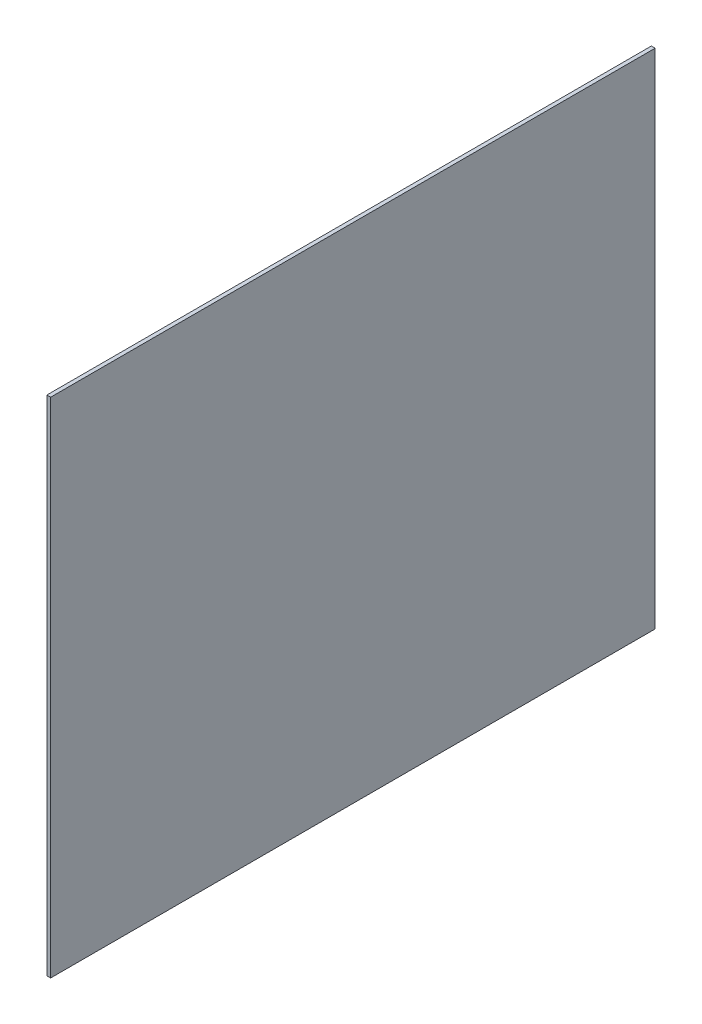
ISO-10303-21;
HEADER;
FILE_DESCRIPTION(('STEP AP214'),'2;1');
FILE_NAME('part.step','',(''),(''),'','','');
FILE_SCHEMA(('AUTOMOTIVE_DESIGN { 1 0 10303 214 1 1 1 1 }'));
ENDSEC;
DATA;
#1=APPLICATION_CONTEXT('core data for automotive mechanical design processes');
#2=APPLICATION_PROTOCOL_DEFINITION('international standard','automotive_design',2000,#1);
#3=PRODUCT_CONTEXT('',#1,'mechanical');
#4=PRODUCT('Part','Part','',(#3));
#5=PRODUCT_RELATED_PRODUCT_CATEGORY('part','',(#4));
#6=PRODUCT_DEFINITION_FORMATION('','',#4);
#7=PRODUCT_DEFINITION_CONTEXT('part definition',#1,'design');
#8=PRODUCT_DEFINITION('design','',#6,#7);
#9=PRODUCT_DEFINITION_SHAPE('','',#8);
#10=(LENGTH_UNIT() NAMED_UNIT(*) SI_UNIT(.MILLI.,.METRE.));
#11=(NAMED_UNIT(*) PLANE_ANGLE_UNIT() SI_UNIT($,.RADIAN.));
#12=(NAMED_UNIT(*) SI_UNIT($,.STERADIAN.) SOLID_ANGLE_UNIT());
#13=UNCERTAINTY_MEASURE_WITH_UNIT(LENGTH_MEASURE(1.E-05),#10,'distance_accuracy_value','');
#14=(GEOMETRIC_REPRESENTATION_CONTEXT(3) GLOBAL_UNCERTAINTY_ASSIGNED_CONTEXT((#13)) GLOBAL_UNIT_ASSIGNED_CONTEXT((#10,
#11,#12)) REPRESENTATION_CONTEXT('',''));
#15=CARTESIAN_POINT('',(0.,0.,0.));
#16=DIRECTION('',(0.,0.,1.));
#17=DIRECTION('',(1.,0.,0.));
#18=AXIS2_PLACEMENT_3D('',#15,#16,#17);
#19=CARTESIAN_POINT('',(-12.5,-1664.15980180936,2000.));
#20=DIRECTION('',(1.,0.,0.));
#21=DIRECTION('',(0.,0.,-1.));
#22=AXIS2_PLACEMENT_3D('',#19,#20,#21);
#23=PLANE('',#22);
#24=DIRECTION('',(0.,-1.,0.));
#25=VECTOR('',#24,1.);
#26=CARTESIAN_POINT('',(-12.5,-1664.15980180936,-2000.));
#27=LINE('',#26,#25);
#28=CARTESIAN_POINT('',(-12.5,1664.15980180936,-2000.));
#29=VERTEX_POINT('',#28);
#30=CARTESIAN_POINT('',(-12.5,-1664.15980180936,-2000.));
#31=VERTEX_POINT('',#30);
#32=EDGE_CURVE('E105',#29,#31,#27,.T.);
#33=ORIENTED_EDGE('',*,*,#32,.T.);
#34=DIRECTION('',(0.,0.,-1.));
#35=VECTOR('',#34,1.);
#36=CARTESIAN_POINT('',(-12.5,-1664.15980180936,2000.));
#37=LINE('',#36,#35);
#38=CARTESIAN_POINT('',(-12.5,-1664.15980180936,2000.));
#39=VERTEX_POINT('',#38);
#40=EDGE_CURVE('E11',#39,#31,#37,.T.);
#41=ORIENTED_EDGE('',*,*,#40,.F.);
#42=DIRECTION('',(0.,-1.,0.));
#43=VECTOR('',#42,1.);
#44=CARTESIAN_POINT('',(-12.5,-1664.15980180936,2000.));
#45=LINE('',#44,#43);
#46=CARTESIAN_POINT('',(-12.5,1664.15980180936,2000.));
#47=VERTEX_POINT('',#46);
#48=EDGE_CURVE('E89',#47,#39,#45,.T.);
#49=ORIENTED_EDGE('',*,*,#48,.F.);
#50=DIRECTION('',(0.,0.,-1.));
#51=VECTOR('',#50,1.);
#52=CARTESIAN_POINT('',(-12.5,1664.15980180936,2000.));
#53=LINE('',#52,#51);
#54=EDGE_CURVE('E98',#47,#29,#53,.T.);
#55=ORIENTED_EDGE('',*,*,#54,.T.);
#56=EDGE_LOOP('',(#33,#41,#49,#55));
#57=FACE_BOUND('',#56,.T.);
#58=ADVANCED_FACE('F39',(#57),#23,.F.);
#59=CARTESIAN_POINT('',(-12.5,-1664.15980180936,2000.));
#60=DIRECTION('',(0.,1.,0.));
#61=DIRECTION('',(0.,0.,1.));
#62=AXIS2_PLACEMENT_3D('',#59,#60,#61);
#63=PLANE('',#62);
#64=DIRECTION('',(1.,0.,0.));
#65=VECTOR('',#64,1.);
#66=CARTESIAN_POINT('',(-12.5,-1664.15980180936,-2000.));
#67=LINE('',#66,#65);
#68=CARTESIAN_POINT('',(12.5,-1664.15980180936,-2000.));
#69=VERTEX_POINT('',#68);
#70=EDGE_CURVE('E94',#31,#69,#67,.T.);
#71=ORIENTED_EDGE('',*,*,#70,.T.);
#72=DIRECTION('',(0.,0.,-1.));
#73=VECTOR('',#72,1.);
#74=CARTESIAN_POINT('',(12.5,-1664.15980180936,2000.));
#75=LINE('',#74,#73);
#76=CARTESIAN_POINT('',(12.5,-1664.15980180936,2000.));
#77=VERTEX_POINT('',#76);
#78=EDGE_CURVE('E50',#77,#69,#75,.T.);
#79=ORIENTED_EDGE('',*,*,#78,.F.);
#80=DIRECTION('',(1.,0.,0.));
#81=VECTOR('',#80,1.);
#82=CARTESIAN_POINT('',(-12.5,-1664.15980180936,2000.));
#83=LINE('',#82,#81);
#84=EDGE_CURVE('E83',#39,#77,#83,.T.);
#85=ORIENTED_EDGE('',*,*,#84,.F.);
#86=ORIENTED_EDGE('',*,*,#40,.T.);
#87=EDGE_LOOP('',(#71,#79,#85,#86));
#88=FACE_BOUND('',#87,.T.);
#89=ADVANCED_FACE('F91',(#88),#63,.F.);
#90=CARTESIAN_POINT('',(12.5,-1664.15980180936,2000.));
#91=DIRECTION('',(-1.,0.,0.));
#92=DIRECTION('',(0.,0.,1.));
#93=AXIS2_PLACEMENT_3D('',#90,#91,#92);
#94=PLANE('',#93);
#95=DIRECTION('',(0.,1.,0.));
#96=VECTOR('',#95,1.);
#97=CARTESIAN_POINT('',(12.5,-1664.15980180936,-2000.));
#98=LINE('',#97,#96);
#99=CARTESIAN_POINT('',(12.5,1664.15980180936,-2000.));
#100=VERTEX_POINT('',#99);
#101=EDGE_CURVE('E75',#69,#100,#98,.T.);
#102=ORIENTED_EDGE('',*,*,#101,.T.);
#103=DIRECTION('',(0.,0.,-1.));
#104=VECTOR('',#103,1.);
#105=CARTESIAN_POINT('',(12.5,1664.15980180936,2000.));
#106=LINE('',#105,#104);
#107=CARTESIAN_POINT('',(12.5,1664.15980180936,2000.));
#108=VERTEX_POINT('',#107);
#109=EDGE_CURVE('E92',#108,#100,#106,.T.);
#110=ORIENTED_EDGE('',*,*,#109,.F.);
#111=DIRECTION('',(0.,1.,0.));
#112=VECTOR('',#111,1.);
#113=CARTESIAN_POINT('',(12.5,-1664.15980180936,2000.));
#114=LINE('',#113,#112);
#115=EDGE_CURVE('E86',#77,#108,#114,.T.);
#116=ORIENTED_EDGE('',*,*,#115,.F.);
#117=ORIENTED_EDGE('',*,*,#78,.T.);
#118=EDGE_LOOP('',(#102,#110,#116,#117));
#119=FACE_BOUND('',#118,.T.);
#120=ADVANCED_FACE('F96',(#119),#94,.F.);
#121=CARTESIAN_POINT('',(-12.5,1664.15980180936,2000.));
#122=DIRECTION('',(0.,-1.,0.));
#123=DIRECTION('',(0.,0.,-1.));
#124=AXIS2_PLACEMENT_3D('',#121,#122,#123);
#125=PLANE('',#124);
#126=DIRECTION('',(-1.,0.,0.));
#127=VECTOR('',#126,1.);
#128=CARTESIAN_POINT('',(-12.5,1664.15980180936,-2000.));
#129=LINE('',#128,#127);
#130=EDGE_CURVE('E79',#100,#29,#129,.T.);
#131=ORIENTED_EDGE('',*,*,#130,.T.);
#132=ORIENTED_EDGE('',*,*,#54,.F.);
#133=DIRECTION('',(-1.,0.,0.));
#134=VECTOR('',#133,1.);
#135=CARTESIAN_POINT('',(-12.5,1664.15980180936,2000.));
#136=LINE('',#135,#134);
#137=EDGE_CURVE('E54',#108,#47,#136,.T.);
#138=ORIENTED_EDGE('',*,*,#137,.F.);
#139=ORIENTED_EDGE('',*,*,#109,.T.);
#140=EDGE_LOOP('',(#131,#132,#138,#139));
#141=FACE_BOUND('',#140,.T.);
#142=ADVANCED_FACE('F108',(#141),#125,.F.);
#143=CARTESIAN_POINT('',(0.,0.,2000.));
#144=DIRECTION('',(0.,0.,-1.));
#145=DIRECTION('',(-1.,0.,0.));
#146=AXIS2_PLACEMENT_3D('',#143,#144,#145);
#147=PLANE('',#146);
#148=ORIENTED_EDGE('',*,*,#48,.T.);
#149=ORIENTED_EDGE('',*,*,#84,.T.);
#150=ORIENTED_EDGE('',*,*,#115,.T.);
#151=ORIENTED_EDGE('',*,*,#137,.T.);
#152=EDGE_LOOP('',(#148,#149,#150,#151));
#153=FACE_BOUND('',#152,.T.);
#154=ADVANCED_FACE('F88',(#153),#147,.F.);
#155=CARTESIAN_POINT('',(0.,0.,-2000.));
#156=DIRECTION('',(0.,0.,-1.));
#157=DIRECTION('',(-1.,0.,0.));
#158=AXIS2_PLACEMENT_3D('',#155,#156,#157);
#159=PLANE('',#158);
#160=ORIENTED_EDGE('',*,*,#32,.F.);
#161=ORIENTED_EDGE('',*,*,#130,.F.);
#162=ORIENTED_EDGE('',*,*,#101,.F.);
#163=ORIENTED_EDGE('',*,*,#70,.F.);
#164=EDGE_LOOP('',(#160,#161,#162,#163));
#165=FACE_BOUND('',#164,.T.);
#166=ADVANCED_FACE('F115',(#165),#159,.T.);
#167=CLOSED_SHELL('',(#58,#89,#120,#142,#154,#166));
#168=MANIFOLD_SOLID_BREP('B2',#167);
#169=ADVANCED_BREP_SHAPE_REPRESENTATION('',(#18,#168),#14);
#170=SHAPE_DEFINITION_REPRESENTATION(#9,#169);
ENDSEC;
END-ISO-10303-21;
